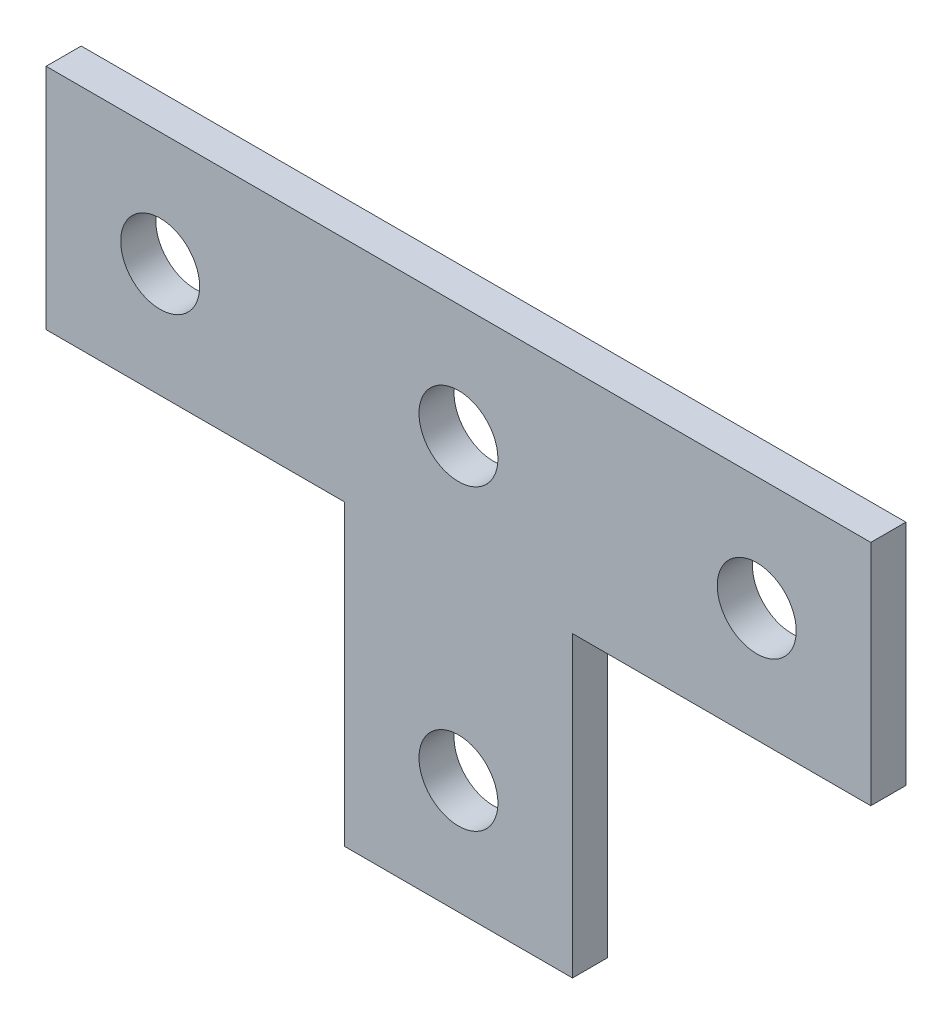
ISO-10303-21;
HEADER;
FILE_DESCRIPTION(('STEP AP214'),'2;1');
FILE_NAME('part.step','',(''),(''),'','','');
FILE_SCHEMA(('AUTOMOTIVE_DESIGN { 1 0 10303 214 1 1 1 1 }'));
ENDSEC;
DATA;
#1=APPLICATION_CONTEXT('core data for automotive mechanical design processes');
#2=APPLICATION_PROTOCOL_DEFINITION('international standard','automotive_design',2000,#1);
#3=PRODUCT_CONTEXT('',#1,'mechanical');
#4=PRODUCT('Part','Part','',(#3));
#5=PRODUCT_RELATED_PRODUCT_CATEGORY('part','',(#4));
#6=PRODUCT_DEFINITION_FORMATION('','',#4);
#7=PRODUCT_DEFINITION_CONTEXT('part definition',#1,'design');
#8=PRODUCT_DEFINITION('design','',#6,#7);
#9=PRODUCT_DEFINITION_SHAPE('','',#8);
#10=(LENGTH_UNIT() NAMED_UNIT(*) SI_UNIT(.MILLI.,.METRE.));
#11=(NAMED_UNIT(*) PLANE_ANGLE_UNIT() SI_UNIT($,.RADIAN.));
#12=(NAMED_UNIT(*) SI_UNIT($,.STERADIAN.) SOLID_ANGLE_UNIT());
#13=UNCERTAINTY_MEASURE_WITH_UNIT(LENGTH_MEASURE(1.E-05),#10,'distance_accuracy_value','');
#14=(GEOMETRIC_REPRESENTATION_CONTEXT(3) GLOBAL_UNCERTAINTY_ASSIGNED_CONTEXT((#13)) GLOBAL_UNIT_ASSIGNED_CONTEXT((#10,
#11,#12)) REPRESENTATION_CONTEXT('',''));
#15=CARTESIAN_POINT('',(0.,0.,0.));
#16=DIRECTION('',(0.,0.,1.));
#17=DIRECTION('',(1.,0.,0.));
#18=AXIS2_PLACEMENT_3D('',#15,#16,#17);
#19=CARTESIAN_POINT('',(-10.31875,3.17499999999999,-1.5875));
#20=DIRECTION('',(-1.,0.,0.));
#21=DIRECTION('',(0.,-1.,0.));
#22=AXIS2_PLACEMENT_3D('',#19,#20,#21);
#23=PLANE('',#22);
#24=DIRECTION('',(0.,0.,1.));
#25=VECTOR('',#24,1.);
#26=CARTESIAN_POINT('',(-10.31875,-23.8124999999999,-1.5875));
#27=LINE('',#26,#25);
#28=CARTESIAN_POINT('',(-10.31875,-23.8124999999999,-1.5875));
#29=VERTEX_POINT('',#28);
#30=CARTESIAN_POINT('',(-10.31875,-23.8124999999999,1.5875));
#31=VERTEX_POINT('',#30);
#32=EDGE_CURVE('E46',#29,#31,#27,.T.);
#33=ORIENTED_EDGE('',*,*,#32,.T.);
#34=DIRECTION('',(0.,-1.,0.));
#35=VECTOR('',#34,1.);
#36=CARTESIAN_POINT('',(-10.31875,3.17499999999999,1.5875));
#37=LINE('',#36,#35);
#38=CARTESIAN_POINT('',(-10.31875,3.17499999999999,1.5875));
#39=VERTEX_POINT('',#38);
#40=EDGE_CURVE('E108',#39,#31,#37,.T.);
#41=ORIENTED_EDGE('',*,*,#40,.F.);
#42=DIRECTION('',(0.,0.,1.));
#43=VECTOR('',#42,1.);
#44=CARTESIAN_POINT('',(-10.31875,3.17499999999999,-1.5875));
#45=LINE('',#44,#43);
#46=CARTESIAN_POINT('',(-10.31875,3.17499999999999,-1.5875));
#47=VERTEX_POINT('',#46);
#48=EDGE_CURVE('E11',#47,#39,#45,.T.);
#49=ORIENTED_EDGE('',*,*,#48,.F.);
#50=DIRECTION('',(0.,-1.,0.));
#51=VECTOR('',#50,1.);
#52=CARTESIAN_POINT('',(-10.31875,3.17499999999999,-1.5875));
#53=LINE('',#52,#51);
#54=EDGE_CURVE('E109',#47,#29,#53,.T.);
#55=ORIENTED_EDGE('',*,*,#54,.T.);
#56=EDGE_LOOP('',(#33,#41,#49,#55));
#57=FACE_BOUND('',#56,.T.);
#58=ADVANCED_FACE('F43',(#57),#23,.T.);
#59=CARTESIAN_POINT('',(-37.30625,3.17499999999999,-1.5875));
#60=DIRECTION('',(0.,-1.,0.));
#61=DIRECTION('',(0.,0.,-1.));
#62=AXIS2_PLACEMENT_3D('',#59,#60,#61);
#63=PLANE('',#62);
#64=ORIENTED_EDGE('',*,*,#48,.T.);
#65=DIRECTION('',(1.,0.,0.));
#66=VECTOR('',#65,1.);
#67=CARTESIAN_POINT('',(-37.30625,3.17499999999999,1.5875));
#68=LINE('',#67,#66);
#69=CARTESIAN_POINT('',(-37.30625,3.17499999999999,1.5875));
#70=VERTEX_POINT('',#69);
#71=EDGE_CURVE('E129',#70,#39,#68,.T.);
#72=ORIENTED_EDGE('',*,*,#71,.F.);
#73=DIRECTION('',(0.,0.,1.));
#74=VECTOR('',#73,1.);
#75=CARTESIAN_POINT('',(-37.30625,3.17499999999999,-1.5875));
#76=LINE('',#75,#74);
#77=CARTESIAN_POINT('',(-37.30625,3.17499999999999,-1.5875));
#78=VERTEX_POINT('',#77);
#79=EDGE_CURVE('E52',#78,#70,#76,.T.);
#80=ORIENTED_EDGE('',*,*,#79,.F.);
#81=DIRECTION('',(1.,0.,0.));
#82=VECTOR('',#81,1.);
#83=CARTESIAN_POINT('',(-37.30625,3.17499999999999,-1.5875));
#84=LINE('',#83,#82);
#85=EDGE_CURVE('E115',#78,#47,#84,.T.);
#86=ORIENTED_EDGE('',*,*,#85,.T.);
#87=EDGE_LOOP('',(#64,#72,#80,#86));
#88=FACE_BOUND('',#87,.T.);
#89=ADVANCED_FACE('F236',(#88),#63,.T.);
#90=CARTESIAN_POINT('',(-37.30625,23.8125,-1.5875));
#91=DIRECTION('',(-1.,0.,0.));
#92=DIRECTION('',(0.,-1.,0.));
#93=AXIS2_PLACEMENT_3D('',#90,#91,#92);
#94=PLANE('',#93);
#95=ORIENTED_EDGE('',*,*,#79,.T.);
#96=DIRECTION('',(0.,-1.,0.));
#97=VECTOR('',#96,1.);
#98=CARTESIAN_POINT('',(-37.30625,23.8125,1.5875));
#99=LINE('',#98,#97);
#100=CARTESIAN_POINT('',(-37.30625,23.8125,1.5875));
#101=VERTEX_POINT('',#100);
#102=EDGE_CURVE('E153',#101,#70,#99,.T.);
#103=ORIENTED_EDGE('',*,*,#102,.F.);
#104=DIRECTION('',(0.,0.,1.));
#105=VECTOR('',#104,1.);
#106=CARTESIAN_POINT('',(-37.30625,23.8125,-1.5875));
#107=LINE('',#106,#105);
#108=CARTESIAN_POINT('',(-37.30625,23.8125,-1.5875));
#109=VERTEX_POINT('',#108);
#110=EDGE_CURVE('E202',#109,#101,#107,.T.);
#111=ORIENTED_EDGE('',*,*,#110,.F.);
#112=DIRECTION('',(0.,-1.,0.));
#113=VECTOR('',#112,1.);
#114=CARTESIAN_POINT('',(-37.30625,23.8125,-1.5875));
#115=LINE('',#114,#113);
#116=EDGE_CURVE('E195',#109,#78,#115,.T.);
#117=ORIENTED_EDGE('',*,*,#116,.T.);
#118=EDGE_LOOP('',(#95,#103,#111,#117));
#119=FACE_BOUND('',#118,.T.);
#120=ADVANCED_FACE('F235',(#119),#94,.T.);
#121=CARTESIAN_POINT('',(37.30625,23.8125,-1.5875));
#122=DIRECTION('',(0.,1.,0.));
#123=DIRECTION('',(-1.,0.,0.));
#124=AXIS2_PLACEMENT_3D('',#121,#122,#123);
#125=PLANE('',#124);
#126=ORIENTED_EDGE('',*,*,#110,.T.);
#127=DIRECTION('',(-1.,0.,0.));
#128=VECTOR('',#127,1.);
#129=CARTESIAN_POINT('',(37.30625,23.8125,1.5875));
#130=LINE('',#129,#128);
#131=CARTESIAN_POINT('',(37.30625,23.8125,1.5875));
#132=VERTEX_POINT('',#131);
#133=EDGE_CURVE('E149',#132,#101,#130,.T.);
#134=ORIENTED_EDGE('',*,*,#133,.F.);
#135=DIRECTION('',(0.,0.,1.));
#136=VECTOR('',#135,1.);
#137=CARTESIAN_POINT('',(37.30625,23.8125,-1.5875));
#138=LINE('',#137,#136);
#139=CARTESIAN_POINT('',(37.30625,23.8125,-1.5875));
#140=VERTEX_POINT('',#139);
#141=EDGE_CURVE('E205',#140,#132,#138,.T.);
#142=ORIENTED_EDGE('',*,*,#141,.F.);
#143=DIRECTION('',(-1.,0.,0.));
#144=VECTOR('',#143,1.);
#145=CARTESIAN_POINT('',(37.30625,23.8125,-1.5875));
#146=LINE('',#145,#144);
#147=EDGE_CURVE('E191',#140,#109,#146,.T.);
#148=ORIENTED_EDGE('',*,*,#147,.T.);
#149=EDGE_LOOP('',(#126,#134,#142,#148));
#150=FACE_BOUND('',#149,.T.);
#151=ADVANCED_FACE('F231',(#150),#125,.T.);
#152=CARTESIAN_POINT('',(37.30625,3.1749999999998,-1.5875));
#153=DIRECTION('',(1.,0.,0.));
#154=DIRECTION('',(0.,1.,0.));
#155=AXIS2_PLACEMENT_3D('',#152,#153,#154);
#156=PLANE('',#155);
#157=ORIENTED_EDGE('',*,*,#141,.T.);
#158=DIRECTION('',(0.,1.,0.));
#159=VECTOR('',#158,1.);
#160=CARTESIAN_POINT('',(37.30625,3.1749999999998,1.5875));
#161=LINE('',#160,#159);
#162=CARTESIAN_POINT('',(37.30625,3.1749999999998,1.5875));
#163=VERTEX_POINT('',#162);
#164=EDGE_CURVE('E145',#163,#132,#161,.T.);
#165=ORIENTED_EDGE('',*,*,#164,.F.);
#166=DIRECTION('',(0.,0.,1.));
#167=VECTOR('',#166,1.);
#168=CARTESIAN_POINT('',(37.30625,3.1749999999998,-1.5875));
#169=LINE('',#168,#167);
#170=CARTESIAN_POINT('',(37.30625,3.1749999999998,-1.5875));
#171=VERTEX_POINT('',#170);
#172=EDGE_CURVE('E208',#171,#163,#169,.T.);
#173=ORIENTED_EDGE('',*,*,#172,.F.);
#174=DIRECTION('',(0.,1.,0.));
#175=VECTOR('',#174,1.);
#176=CARTESIAN_POINT('',(37.30625,3.1749999999998,-1.5875));
#177=LINE('',#176,#175);
#178=EDGE_CURVE('E187',#171,#140,#177,.T.);
#179=ORIENTED_EDGE('',*,*,#178,.T.);
#180=EDGE_LOOP('',(#157,#165,#173,#179));
#181=FACE_BOUND('',#180,.T.);
#182=ADVANCED_FACE('F224',(#181),#156,.T.);
#183=CARTESIAN_POINT('',(10.31875,3.17499999999999,-1.5875));
#184=DIRECTION('',(0.,-1.,0.));
#185=DIRECTION('',(1.,0.,0.));
#186=AXIS2_PLACEMENT_3D('',#183,#184,#185);
#187=PLANE('',#186);
#188=ORIENTED_EDGE('',*,*,#172,.T.);
#189=DIRECTION('',(1.,0.,0.));
#190=VECTOR('',#189,1.);
#191=CARTESIAN_POINT('',(10.31875,3.17499999999999,1.5875));
#192=LINE('',#191,#190);
#193=CARTESIAN_POINT('',(10.31875,3.17499999999999,1.5875));
#194=VERTEX_POINT('',#193);
#195=EDGE_CURVE('E141',#194,#163,#192,.T.);
#196=ORIENTED_EDGE('',*,*,#195,.F.);
#197=DIRECTION('',(0.,0.,1.));
#198=VECTOR('',#197,1.);
#199=CARTESIAN_POINT('',(10.31875,3.17499999999999,-1.5875));
#200=LINE('',#199,#198);
#201=CARTESIAN_POINT('',(10.31875,3.17499999999999,-1.5875));
#202=VERTEX_POINT('',#201);
#203=EDGE_CURVE('E211',#202,#194,#200,.T.);
#204=ORIENTED_EDGE('',*,*,#203,.F.);
#205=DIRECTION('',(1.,0.,0.));
#206=VECTOR('',#205,1.);
#207=CARTESIAN_POINT('',(10.31875,3.17499999999999,-1.5875));
#208=LINE('',#207,#206);
#209=EDGE_CURVE('E183',#202,#171,#208,.T.);
#210=ORIENTED_EDGE('',*,*,#209,.T.);
#211=EDGE_LOOP('',(#188,#196,#204,#210));
#212=FACE_BOUND('',#211,.T.);
#213=ADVANCED_FACE('F221',(#212),#187,.T.);
#214=CARTESIAN_POINT('',(10.31875,-23.8124999999999,-1.5875));
#215=DIRECTION('',(1.,0.,0.));
#216=DIRECTION('',(0.,1.,0.));
#217=AXIS2_PLACEMENT_3D('',#214,#215,#216);
#218=PLANE('',#217);
#219=ORIENTED_EDGE('',*,*,#203,.T.);
#220=DIRECTION('',(0.,1.,0.));
#221=VECTOR('',#220,1.);
#222=CARTESIAN_POINT('',(10.31875,-23.8124999999999,1.5875));
#223=LINE('',#222,#221);
#224=CARTESIAN_POINT('',(10.31875,-23.8124999999999,1.5875));
#225=VERTEX_POINT('',#224);
#226=EDGE_CURVE('E123',#225,#194,#223,.T.);
#227=ORIENTED_EDGE('',*,*,#226,.F.);
#228=DIRECTION('',(0.,0.,1.));
#229=VECTOR('',#228,1.);
#230=CARTESIAN_POINT('',(10.31875,-23.8124999999999,-1.5875));
#231=LINE('',#230,#229);
#232=CARTESIAN_POINT('',(10.31875,-23.8124999999999,-1.5875));
#233=VERTEX_POINT('',#232);
#234=EDGE_CURVE('E114',#233,#225,#231,.T.);
#235=ORIENTED_EDGE('',*,*,#234,.F.);
#236=DIRECTION('',(0.,1.,0.));
#237=VECTOR('',#236,1.);
#238=CARTESIAN_POINT('',(10.31875,-23.8124999999999,-1.5875));
#239=LINE('',#238,#237);
#240=EDGE_CURVE('E179',#233,#202,#239,.T.);
#241=ORIENTED_EDGE('',*,*,#240,.T.);
#242=EDGE_LOOP('',(#219,#227,#235,#241));
#243=FACE_BOUND('',#242,.T.);
#244=ADVANCED_FACE('F215',(#243),#218,.T.);
#245=CARTESIAN_POINT('',(-10.31875,-23.8124999999999,-1.5875));
#246=DIRECTION('',(0.,-1.,0.));
#247=DIRECTION('',(1.,0.,0.));
#248=AXIS2_PLACEMENT_3D('',#245,#246,#247);
#249=PLANE('',#248);
#250=ORIENTED_EDGE('',*,*,#234,.T.);
#251=DIRECTION('',(1.,0.,0.));
#252=VECTOR('',#251,1.);
#253=CARTESIAN_POINT('',(-10.31875,-23.8124999999999,1.5875));
#254=LINE('',#253,#252);
#255=EDGE_CURVE('E117',#31,#225,#254,.T.);
#256=ORIENTED_EDGE('',*,*,#255,.F.);
#257=ORIENTED_EDGE('',*,*,#32,.F.);
#258=DIRECTION('',(1.,0.,0.));
#259=VECTOR('',#258,1.);
#260=CARTESIAN_POINT('',(-10.31875,-23.8124999999999,-1.5875));
#261=LINE('',#260,#259);
#262=EDGE_CURVE('E176',#29,#233,#261,.T.);
#263=ORIENTED_EDGE('',*,*,#262,.T.);
#264=EDGE_LOOP('',(#250,#256,#257,#263));
#265=FACE_BOUND('',#264,.T.);
#266=ADVANCED_FACE('F118',(#265),#249,.T.);
#267=CARTESIAN_POINT('',(0.,0.,-1.5875));
#268=DIRECTION('',(0.,0.,1.));
#269=DIRECTION('',(1.,0.,0.));
#270=AXIS2_PLACEMENT_3D('',#267,#268,#269);
#271=PLANE('',#270);
#272=CARTESIAN_POINT('',(0.,13.4937499999999,-1.5875));
#273=DIRECTION('',(0.,0.,1.));
#274=DIRECTION('',(1.,0.,0.));
#275=AXIS2_PLACEMENT_3D('',#272,#273,#274);
#276=CIRCLE('',#275,3.571875);
#277=CARTESIAN_POINT('',(3.571875,13.4937499999999,-1.5875));
#278=VERTEX_POINT('',#277);
#279=EDGE_CURVE('E158',#278,#278,#276,.T.);
#280=ORIENTED_EDGE('',*,*,#279,.T.);
#281=EDGE_LOOP('',(#280));
#282=FACE_BOUND('',#281,.T.);
#283=CARTESIAN_POINT('',(-26.9875,13.4937499999999,-1.5875));
#284=DIRECTION('',(0.,0.,1.));
#285=DIRECTION('',(1.,0.,0.));
#286=AXIS2_PLACEMENT_3D('',#283,#284,#285);
#287=CIRCLE('',#286,3.571875);
#288=CARTESIAN_POINT('',(-23.415625,13.4937499999999,-1.5875));
#289=VERTEX_POINT('',#288);
#290=EDGE_CURVE('E162',#289,#289,#287,.T.);
#291=ORIENTED_EDGE('',*,*,#290,.T.);
#292=EDGE_LOOP('',(#291));
#293=FACE_BOUND('',#292,.T.);
#294=CARTESIAN_POINT('',(0.,-13.4937500000001,-1.5875));
#295=DIRECTION('',(0.,0.,1.));
#296=DIRECTION('',(1.,0.,0.));
#297=AXIS2_PLACEMENT_3D('',#294,#295,#296);
#298=CIRCLE('',#297,3.571875);
#299=CARTESIAN_POINT('',(3.571875,-13.4937500000001,-1.5875));
#300=VERTEX_POINT('',#299);
#301=EDGE_CURVE('E166',#300,#300,#298,.T.);
#302=ORIENTED_EDGE('',*,*,#301,.T.);
#303=EDGE_LOOP('',(#302));
#304=FACE_BOUND('',#303,.T.);
#305=CARTESIAN_POINT('',(26.9875,13.4937499999999,-1.5875));
#306=DIRECTION('',(0.,0.,1.));
#307=DIRECTION('',(1.,0.,0.));
#308=AXIS2_PLACEMENT_3D('',#305,#306,#307);
#309=CIRCLE('',#308,3.571875);
#310=CARTESIAN_POINT('',(30.559375,13.4937499999999,-1.5875));
#311=VERTEX_POINT('',#310);
#312=EDGE_CURVE('E170',#311,#311,#309,.T.);
#313=ORIENTED_EDGE('',*,*,#312,.T.);
#314=EDGE_LOOP('',(#313));
#315=FACE_BOUND('',#314,.T.);
#316=ORIENTED_EDGE('',*,*,#54,.F.);
#317=ORIENTED_EDGE('',*,*,#85,.F.);
#318=ORIENTED_EDGE('',*,*,#116,.F.);
#319=ORIENTED_EDGE('',*,*,#147,.F.);
#320=ORIENTED_EDGE('',*,*,#178,.F.);
#321=ORIENTED_EDGE('',*,*,#209,.F.);
#322=ORIENTED_EDGE('',*,*,#240,.F.);
#323=ORIENTED_EDGE('',*,*,#262,.F.);
#324=EDGE_LOOP('',(#316,#317,#318,#319,#320,#321,#322,#323));
#325=FACE_BOUND('',#324,.T.);
#326=ADVANCED_FACE('F227',(#282,#293,#304,#315,#325),#271,.F.);
#327=CARTESIAN_POINT('',(26.9875,13.4937499999999,-1.5875));
#328=DIRECTION('',(0.,0.,1.));
#329=DIRECTION('',(1.,0.,0.));
#330=AXIS2_PLACEMENT_3D('',#327,#328,#329);
#331=CYLINDRICAL_SURFACE('',#330,3.571875);
#332=ORIENTED_EDGE('',*,*,#312,.F.);
#333=EDGE_LOOP('',(#332));
#334=FACE_BOUND('',#333,.T.);
#335=CARTESIAN_POINT('',(26.9875,13.4937499999999,1.5875));
#336=DIRECTION('',(0.,0.,1.));
#337=DIRECTION('',(1.,0.,0.));
#338=AXIS2_PLACEMENT_3D('',#335,#336,#337);
#339=CIRCLE('',#338,3.571875);
#340=CARTESIAN_POINT('',(30.559375,13.4937499999999,1.5875));
#341=VERTEX_POINT('',#340);
#342=EDGE_CURVE('E131',#341,#341,#339,.T.);
#343=ORIENTED_EDGE('',*,*,#342,.T.);
#344=EDGE_LOOP('',(#343));
#345=FACE_BOUND('',#344,.T.);
#346=ADVANCED_FACE('F258',(#334,#345),#331,.F.);
#347=CARTESIAN_POINT('',(0.,-13.4937500000001,-1.5875));
#348=DIRECTION('',(0.,0.,1.));
#349=DIRECTION('',(1.,0.,0.));
#350=AXIS2_PLACEMENT_3D('',#347,#348,#349);
#351=CYLINDRICAL_SURFACE('',#350,3.571875);
#352=ORIENTED_EDGE('',*,*,#301,.F.);
#353=EDGE_LOOP('',(#352));
#354=FACE_BOUND('',#353,.T.);
#355=CARTESIAN_POINT('',(0.,-13.4937500000001,1.5875));
#356=DIRECTION('',(0.,0.,1.));
#357=DIRECTION('',(1.,0.,0.));
#358=AXIS2_PLACEMENT_3D('',#355,#356,#357);
#359=CIRCLE('',#358,3.571875);
#360=CARTESIAN_POINT('',(3.571875,-13.4937500000001,1.5875));
#361=VERTEX_POINT('',#360);
#362=EDGE_CURVE('E135',#361,#361,#359,.T.);
#363=ORIENTED_EDGE('',*,*,#362,.T.);
#364=EDGE_LOOP('',(#363));
#365=FACE_BOUND('',#364,.T.);
#366=ADVANCED_FACE('F263',(#354,#365),#351,.F.);
#367=CARTESIAN_POINT('',(-26.9875,13.4937499999999,-1.5875));
#368=DIRECTION('',(0.,0.,1.));
#369=DIRECTION('',(1.,0.,0.));
#370=AXIS2_PLACEMENT_3D('',#367,#368,#369);
#371=CYLINDRICAL_SURFACE('',#370,3.571875);
#372=ORIENTED_EDGE('',*,*,#290,.F.);
#373=EDGE_LOOP('',(#372));
#374=FACE_BOUND('',#373,.T.);
#375=CARTESIAN_POINT('',(-26.9875,13.4937499999999,1.5875));
#376=DIRECTION('',(0.,0.,1.));
#377=DIRECTION('',(1.,0.,0.));
#378=AXIS2_PLACEMENT_3D('',#375,#376,#377);
#379=CIRCLE('',#378,3.571875);
#380=CARTESIAN_POINT('',(-23.415625,13.4937499999999,1.5875));
#381=VERTEX_POINT('',#380);
#382=EDGE_CURVE('E298',#381,#381,#379,.T.);
#383=ORIENTED_EDGE('',*,*,#382,.T.);
#384=EDGE_LOOP('',(#383));
#385=FACE_BOUND('',#384,.T.);
#386=ADVANCED_FACE('F282',(#374,#385),#371,.F.);
#387=CARTESIAN_POINT('',(0.,13.4937499999999,-1.5875));
#388=DIRECTION('',(0.,0.,1.));
#389=DIRECTION('',(1.,0.,0.));
#390=AXIS2_PLACEMENT_3D('',#387,#388,#389);
#391=CYLINDRICAL_SURFACE('',#390,3.571875);
#392=ORIENTED_EDGE('',*,*,#279,.F.);
#393=EDGE_LOOP('',(#392));
#394=FACE_BOUND('',#393,.T.);
#395=CARTESIAN_POINT('',(0.,13.4937499999999,1.5875));
#396=DIRECTION('',(0.,0.,1.));
#397=DIRECTION('',(1.,0.,0.));
#398=AXIS2_PLACEMENT_3D('',#395,#396,#397);
#399=CIRCLE('',#398,3.571875);
#400=CARTESIAN_POINT('',(3.571875,13.4937499999999,1.5875));
#401=VERTEX_POINT('',#400);
#402=EDGE_CURVE('E301',#401,#401,#399,.T.);
#403=ORIENTED_EDGE('',*,*,#402,.T.);
#404=EDGE_LOOP('',(#403));
#405=FACE_BOUND('',#404,.T.);
#406=ADVANCED_FACE('F276',(#394,#405),#391,.F.);
#407=CARTESIAN_POINT('',(0.,0.,1.5875));
#408=DIRECTION('',(0.,0.,1.));
#409=DIRECTION('',(1.,0.,0.));
#410=AXIS2_PLACEMENT_3D('',#407,#408,#409);
#411=PLANE('',#410);
#412=ORIENTED_EDGE('',*,*,#382,.F.);
#413=EDGE_LOOP('',(#412));
#414=FACE_BOUND('',#413,.T.);
#415=ORIENTED_EDGE('',*,*,#342,.F.);
#416=EDGE_LOOP('',(#415));
#417=FACE_BOUND('',#416,.T.);
#418=ORIENTED_EDGE('',*,*,#40,.T.);
#419=ORIENTED_EDGE('',*,*,#255,.T.);
#420=ORIENTED_EDGE('',*,*,#226,.T.);
#421=ORIENTED_EDGE('',*,*,#195,.T.);
#422=ORIENTED_EDGE('',*,*,#164,.T.);
#423=ORIENTED_EDGE('',*,*,#133,.T.);
#424=ORIENTED_EDGE('',*,*,#102,.T.);
#425=ORIENTED_EDGE('',*,*,#71,.T.);
#426=EDGE_LOOP('',(#418,#419,#420,#421,#422,#423,#424,#425));
#427=FACE_BOUND('',#426,.T.);
#428=ORIENTED_EDGE('',*,*,#362,.F.);
#429=EDGE_LOOP('',(#428));
#430=FACE_BOUND('',#429,.T.);
#431=ORIENTED_EDGE('',*,*,#402,.F.);
#432=EDGE_LOOP('',(#431));
#433=FACE_BOUND('',#432,.T.);
#434=ADVANCED_FACE('F126',(#414,#417,#427,#430,#433),#411,.T.);
#435=CLOSED_SHELL('',(#58,#89,#120,#151,#182,#213,#244,#266,#326,#346,#366,#386,#406,#434));
#436=MANIFOLD_SOLID_BREP('B2',#435);
#437=ADVANCED_BREP_SHAPE_REPRESENTATION('',(#18,#436),#14);
#438=SHAPE_DEFINITION_REPRESENTATION(#9,#437);
ENDSEC;
END-ISO-10303-21;
